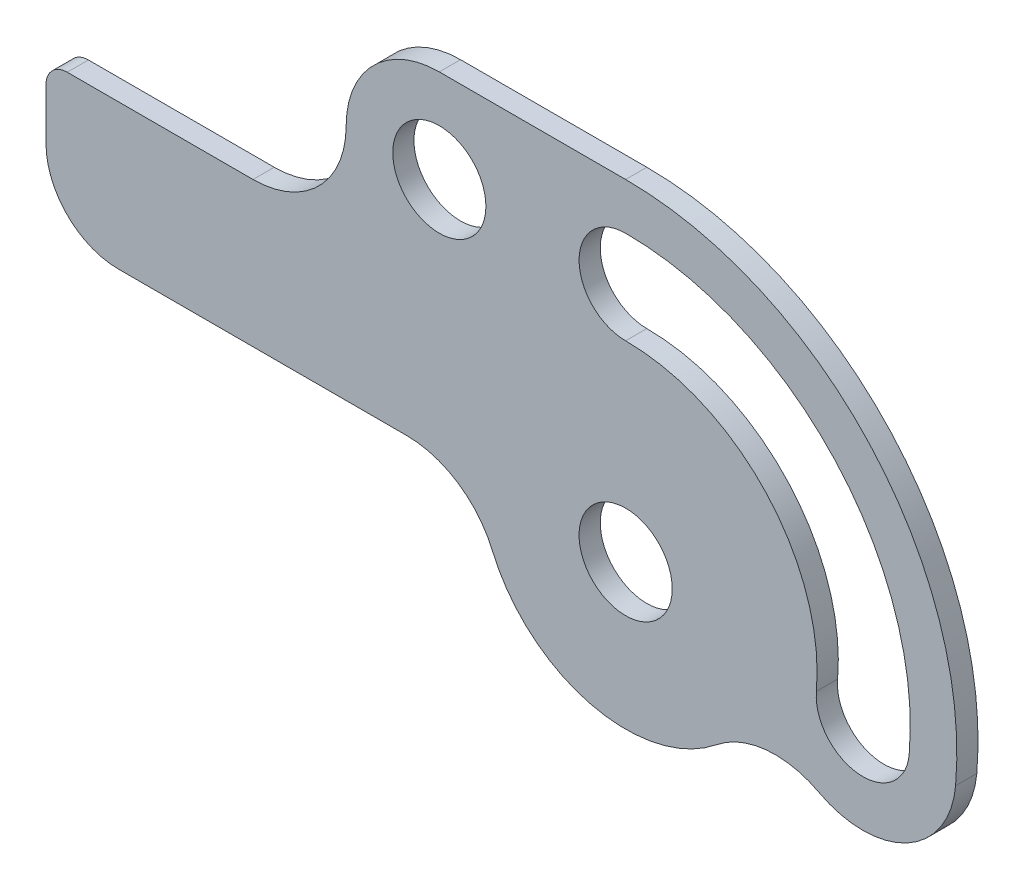
ISO-10303-21;
HEADER;
FILE_DESCRIPTION(('STEP AP214'),'2;1');
FILE_NAME('part.step','',(''),(''),'','','');
FILE_SCHEMA(('AUTOMOTIVE_DESIGN { 1 0 10303 214 1 1 1 1 }'));
ENDSEC;
DATA;
#1=APPLICATION_CONTEXT('core data for automotive mechanical design processes');
#2=APPLICATION_PROTOCOL_DEFINITION('international standard','automotive_design',2000,#1);
#3=PRODUCT_CONTEXT('',#1,'mechanical');
#4=PRODUCT('Part','Part','',(#3));
#5=PRODUCT_RELATED_PRODUCT_CATEGORY('part','',(#4));
#6=PRODUCT_DEFINITION_FORMATION('','',#4);
#7=PRODUCT_DEFINITION_CONTEXT('part definition',#1,'design');
#8=PRODUCT_DEFINITION('design','',#6,#7);
#9=PRODUCT_DEFINITION_SHAPE('','',#8);
#10=(LENGTH_UNIT() NAMED_UNIT(*) SI_UNIT(.MILLI.,.METRE.));
#11=(NAMED_UNIT(*) PLANE_ANGLE_UNIT() SI_UNIT($,.RADIAN.));
#12=(NAMED_UNIT(*) SI_UNIT($,.STERADIAN.) SOLID_ANGLE_UNIT());
#13=UNCERTAINTY_MEASURE_WITH_UNIT(LENGTH_MEASURE(1.E-05),#10,'distance_accuracy_value','');
#14=(GEOMETRIC_REPRESENTATION_CONTEXT(3) GLOBAL_UNCERTAINTY_ASSIGNED_CONTEXT((#13)) GLOBAL_UNIT_ASSIGNED_CONTEXT((#10,
#11,#12)) REPRESENTATION_CONTEXT('',''));
#15=CARTESIAN_POINT('',(0.,0.,0.));
#16=DIRECTION('',(0.,0.,1.));
#17=DIRECTION('',(1.,0.,0.));
#18=AXIS2_PLACEMENT_3D('',#15,#16,#17);
#19=CARTESIAN_POINT('',(2.778125,2.778125,0.8128));
#20=DIRECTION('',(0.,0.,-1.));
#21=DIRECTION('',(-1.,0.,0.));
#22=AXIS2_PLACEMENT_3D('',#19,#20,#21);
#23=CYLINDRICAL_SURFACE('',#22,2.778125);
#24=CARTESIAN_POINT('',(2.778125,2.778125,0.));
#25=DIRECTION('',(0.,0.,1.));
#26=DIRECTION('',(1.,0.,0.));
#27=AXIS2_PLACEMENT_3D('',#24,#25,#26);
#28=CIRCLE('',#27,2.778125);
#29=CARTESIAN_POINT('',(0.,2.778125,0.));
#30=VERTEX_POINT('',#29);
#31=CARTESIAN_POINT('',(2.778125,0.,0.));
#32=VERTEX_POINT('',#31);
#33=EDGE_CURVE('E303',#30,#32,#28,.T.);
#34=ORIENTED_EDGE('',*,*,#33,.T.);
#35=DIRECTION('',(0.,0.,-1.));
#36=VECTOR('',#35,1.);
#37=CARTESIAN_POINT('',(2.778125,0.,0.8128));
#38=LINE('',#37,#36);
#39=CARTESIAN_POINT('',(2.778125,0.,0.8128));
#40=VERTEX_POINT('',#39);
#41=EDGE_CURVE('E334',#40,#32,#38,.T.);
#42=ORIENTED_EDGE('',*,*,#41,.F.);
#43=CARTESIAN_POINT('',(2.778125,2.778125,0.8128));
#44=DIRECTION('',(0.,0.,1.));
#45=DIRECTION('',(1.,0.,0.));
#46=AXIS2_PLACEMENT_3D('',#43,#44,#45);
#47=CIRCLE('',#46,2.778125);
#48=CARTESIAN_POINT('',(0.,2.778125,0.8128));
#49=VERTEX_POINT('',#48);
#50=EDGE_CURVE('E242',#49,#40,#47,.T.);
#51=ORIENTED_EDGE('',*,*,#50,.F.);
#52=DIRECTION('',(0.,0.,-1.));
#53=VECTOR('',#52,1.);
#54=CARTESIAN_POINT('',(0.,2.778125,0.8128));
#55=LINE('',#54,#53);
#56=EDGE_CURVE('E337',#49,#30,#55,.T.);
#57=ORIENTED_EDGE('',*,*,#56,.T.);
#58=EDGE_LOOP('',(#34,#42,#51,#57));
#59=FACE_BOUND('',#58,.T.);
#60=ADVANCED_FACE('F83',(#59),#23,.T.);
#61=CARTESIAN_POINT('',(15.08125,9.128125,0.8128));
#62=DIRECTION('',(0.,0.,-1.));
#63=DIRECTION('',(-1.,0.,0.));
#64=AXIS2_PLACEMENT_3D('',#61,#62,#63);
#65=CYLINDRICAL_SURFACE('',#64,1.7859375);
#66=CARTESIAN_POINT('',(15.08125,9.128125,0.8128));
#67=DIRECTION('',(0.,0.,1.));
#68=DIRECTION('',(1.,0.,0.));
#69=AXIS2_PLACEMENT_3D('',#66,#67,#68);
#70=CIRCLE('',#69,1.7859375);
#71=CARTESIAN_POINT('',(16.8671875,9.128125,0.8128));
#72=VERTEX_POINT('',#71);
#73=EDGE_CURVE('E252',#72,#72,#70,.T.);
#74=ORIENTED_EDGE('',*,*,#73,.T.);
#75=EDGE_LOOP('',(#74));
#76=FACE_BOUND('',#75,.T.);
#77=CARTESIAN_POINT('',(15.08125,9.128125,0.));
#78=DIRECTION('',(0.,0.,1.));
#79=DIRECTION('',(1.,0.,0.));
#80=AXIS2_PLACEMENT_3D('',#77,#78,#79);
#81=CIRCLE('',#80,1.7859375);
#82=CARTESIAN_POINT('',(16.8671875,9.128125,0.));
#83=VERTEX_POINT('',#82);
#84=EDGE_CURVE('E324',#83,#83,#81,.T.);
#85=ORIENTED_EDGE('',*,*,#84,.F.);
#86=EDGE_LOOP('',(#85));
#87=FACE_BOUND('',#86,.T.);
#88=ADVANCED_FACE('F440',(#76,#87),#65,.F.);
#89=CARTESIAN_POINT('',(22.225,0.,0.8128));
#90=DIRECTION('',(0.,0.,-1.));
#91=DIRECTION('',(-1.,0.,0.));
#92=AXIS2_PLACEMENT_3D('',#89,#90,#91);
#93=CYLINDRICAL_SURFACE('',#92,1.7859375);
#94=CARTESIAN_POINT('',(22.225,0.,0.8128));
#95=DIRECTION('',(0.,0.,1.));
#96=DIRECTION('',(1.,0.,0.));
#97=AXIS2_PLACEMENT_3D('',#94,#95,#96);
#98=CIRCLE('',#97,1.7859375);
#99=CARTESIAN_POINT('',(24.0109375,0.,0.8128));
#100=VERTEX_POINT('',#99);
#101=EDGE_CURVE('E248',#100,#100,#98,.T.);
#102=ORIENTED_EDGE('',*,*,#101,.T.);
#103=EDGE_LOOP('',(#102));
#104=FACE_BOUND('',#103,.T.);
#105=CARTESIAN_POINT('',(22.225,0.,0.));
#106=DIRECTION('',(0.,0.,1.));
#107=DIRECTION('',(1.,0.,0.));
#108=AXIS2_PLACEMENT_3D('',#105,#106,#107);
#109=CIRCLE('',#108,1.7859375);
#110=CARTESIAN_POINT('',(24.0109375,0.,0.));
#111=VERTEX_POINT('',#110);
#112=EDGE_CURVE('E320',#111,#111,#109,.T.);
#113=ORIENTED_EDGE('',*,*,#112,.F.);
#114=EDGE_LOOP('',(#113));
#115=FACE_BOUND('',#114,.T.);
#116=ADVANCED_FACE('F442',(#104,#115),#93,.F.);
#117=CARTESIAN_POINT('',(31.3183897285187,-0.795568514268431,0.8128));
#118=DIRECTION('',(0.,0.,-1.));
#119=DIRECTION('',(-1.,0.,0.));
#120=AXIS2_PLACEMENT_3D('',#117,#118,#119);
#121=CYLINDRICAL_SURFACE('',#120,1.7859375);
#122=CARTESIAN_POINT('',(31.3183897285187,-0.795568514268431,0.));
#123=DIRECTION('',(0.,0.,1.));
#124=DIRECTION('',(1.,0.,0.));
#125=AXIS2_PLACEMENT_3D('',#122,#123,#124);
#126=CIRCLE('',#125,1.7859375);
#127=CARTESIAN_POINT('',(29.5392482598955,-0.639913804955042,0.));
#128=VERTEX_POINT('',#127);
#129=CARTESIAN_POINT('',(33.0975311971419,-0.95122322358182,0.));
#130=VERTEX_POINT('',#129);
#131=EDGE_CURVE('E261',#128,#130,#126,.T.);
#132=ORIENTED_EDGE('',*,*,#131,.F.);
#133=DIRECTION('',(0.,0.,-1.));
#134=VECTOR('',#133,1.);
#135=CARTESIAN_POINT('',(29.5392482598955,-0.639913804955042,0.8128));
#136=LINE('',#135,#134);
#137=CARTESIAN_POINT('',(29.5392482598955,-0.639913804955042,0.8128));
#138=VERTEX_POINT('',#137);
#139=EDGE_CURVE('E362',#138,#128,#136,.T.);
#140=ORIENTED_EDGE('',*,*,#139,.F.);
#141=CARTESIAN_POINT('',(31.3183897285187,-0.795568514268431,0.8128));
#142=DIRECTION('',(0.,0.,1.));
#143=DIRECTION('',(1.,0.,0.));
#144=AXIS2_PLACEMENT_3D('',#141,#142,#143);
#145=CIRCLE('',#144,1.7859375);
#146=CARTESIAN_POINT('',(33.0975311971419,-0.95122322358182,0.8128));
#147=VERTEX_POINT('',#146);
#148=EDGE_CURVE('E372',#138,#147,#145,.T.);
#149=ORIENTED_EDGE('',*,*,#148,.T.);
#150=DIRECTION('',(0.,0.,-1.));
#151=VECTOR('',#150,1.);
#152=CARTESIAN_POINT('',(33.0975311971419,-0.95122322358182,0.8128));
#153=LINE('',#152,#151);
#154=EDGE_CURVE('E87',#147,#130,#153,.T.);
#155=ORIENTED_EDGE('',*,*,#154,.T.);
#156=EDGE_LOOP('',(#132,#140,#149,#155));
#157=FACE_BOUND('',#156,.T.);
#158=ADVANCED_FACE('F371',(#157),#121,.F.);
#159=CARTESIAN_POINT('',(22.225,0.,0.8128));
#160=DIRECTION('',(0.,0.,-1.));
#161=DIRECTION('',(-1.,0.,0.));
#162=AXIS2_PLACEMENT_3D('',#159,#160,#161);
#163=CYLINDRICAL_SURFACE('',#162,7.3421875);
#164=CARTESIAN_POINT('',(22.225,0.,0.));
#165=DIRECTION('',(0.,0.,1.));
#166=DIRECTION('',(1.,0.,0.));
#167=AXIS2_PLACEMENT_3D('',#164,#165,#166);
#168=CIRCLE('',#167,7.3421875);
#169=CARTESIAN_POINT('',(22.225,7.3421875,0.));
#170=VERTEX_POINT('',#169);
#171=EDGE_CURVE('E265',#170,#128,#168,.F.);
#172=ORIENTED_EDGE('',*,*,#171,.F.);
#173=DIRECTION('',(0.,0.,-1.));
#174=VECTOR('',#173,1.);
#175=CARTESIAN_POINT('',(22.225,7.3421875,0.8128));
#176=LINE('',#175,#174);
#177=CARTESIAN_POINT('',(22.225,7.3421875,0.8128));
#178=VERTEX_POINT('',#177);
#179=EDGE_CURVE('E360',#178,#170,#176,.T.);
#180=ORIENTED_EDGE('',*,*,#179,.F.);
#181=CARTESIAN_POINT('',(22.225,0.,0.8128));
#182=DIRECTION('',(0.,0.,1.));
#183=DIRECTION('',(1.,0.,0.));
#184=AXIS2_PLACEMENT_3D('',#181,#182,#183);
#185=CIRCLE('',#184,7.3421875);
#186=EDGE_CURVE('E381',#178,#138,#185,.F.);
#187=ORIENTED_EDGE('',*,*,#186,.T.);
#188=ORIENTED_EDGE('',*,*,#139,.T.);
#189=EDGE_LOOP('',(#172,#180,#187,#188));
#190=FACE_BOUND('',#189,.T.);
#191=ADVANCED_FACE('F379',(#190),#163,.T.);
#192=CARTESIAN_POINT('',(22.225,9.128125,0.8128));
#193=DIRECTION('',(0.,0.,-1.));
#194=DIRECTION('',(-1.,0.,0.));
#195=AXIS2_PLACEMENT_3D('',#192,#193,#194);
#196=CYLINDRICAL_SURFACE('',#195,1.7859375);
#197=CARTESIAN_POINT('',(22.225,9.128125,0.));
#198=DIRECTION('',(0.,0.,1.));
#199=DIRECTION('',(1.,0.,0.));
#200=AXIS2_PLACEMENT_3D('',#197,#198,#199);
#201=CIRCLE('',#200,1.7859375);
#202=CARTESIAN_POINT('',(22.225,10.9140625,0.));
#203=VERTEX_POINT('',#202);
#204=EDGE_CURVE('E269',#203,#170,#201,.T.);
#205=ORIENTED_EDGE('',*,*,#204,.F.);
#206=DIRECTION('',(0.,0.,-1.));
#207=VECTOR('',#206,1.);
#208=CARTESIAN_POINT('',(22.225,10.9140625,0.8128));
#209=LINE('',#208,#207);
#210=CARTESIAN_POINT('',(22.225,10.9140625,0.8128));
#211=VERTEX_POINT('',#210);
#212=EDGE_CURVE('E256',#211,#203,#209,.T.);
#213=ORIENTED_EDGE('',*,*,#212,.F.);
#214=CARTESIAN_POINT('',(22.225,9.128125,0.8128));
#215=DIRECTION('',(0.,0.,1.));
#216=DIRECTION('',(1.,0.,0.));
#217=AXIS2_PLACEMENT_3D('',#214,#215,#216);
#218=CIRCLE('',#217,1.7859375);
#219=EDGE_CURVE('E384',#211,#178,#218,.T.);
#220=ORIENTED_EDGE('',*,*,#219,.T.);
#221=ORIENTED_EDGE('',*,*,#179,.T.);
#222=EDGE_LOOP('',(#205,#213,#220,#221));
#223=FACE_BOUND('',#222,.T.);
#224=ADVANCED_FACE('F387',(#223),#196,.F.);
#225=CARTESIAN_POINT('',(22.225,0.,0.8128));
#226=DIRECTION('',(0.,0.,-1.));
#227=DIRECTION('',(-1.,0.,0.));
#228=AXIS2_PLACEMENT_3D('',#225,#226,#227);
#229=CYLINDRICAL_SURFACE('',#228,10.9140625);
#230=CARTESIAN_POINT('',(22.225,0.,0.));
#231=DIRECTION('',(0.,0.,1.));
#232=DIRECTION('',(1.,0.,0.));
#233=AXIS2_PLACEMENT_3D('',#230,#231,#232);
#234=CIRCLE('',#233,10.9140625);
#235=EDGE_CURVE('E257',#203,#130,#234,.F.);
#236=ORIENTED_EDGE('',*,*,#235,.T.);
#237=ORIENTED_EDGE('',*,*,#154,.F.);
#238=CARTESIAN_POINT('',(22.225,0.,0.8128));
#239=DIRECTION('',(0.,0.,1.));
#240=DIRECTION('',(1.,0.,0.));
#241=AXIS2_PLACEMENT_3D('',#238,#239,#240);
#242=CIRCLE('',#241,10.9140625);
#243=EDGE_CURVE('E169',#211,#147,#242,.F.);
#244=ORIENTED_EDGE('',*,*,#243,.F.);
#245=ORIENTED_EDGE('',*,*,#212,.T.);
#246=EDGE_LOOP('',(#236,#237,#244,#245));
#247=FACE_BOUND('',#246,.T.);
#248=ADVANCED_FACE('F85',(#247),#229,.F.);
#249=CARTESIAN_POINT('',(0.,0.,0.8128));
#250=DIRECTION('',(0.,-1.,0.));
#251=DIRECTION('',(0.,0.,-1.));
#252=AXIS2_PLACEMENT_3D('',#249,#250,#251);
#253=PLANE('',#252);
#254=DIRECTION('',(-1.,0.,0.));
#255=VECTOR('',#254,1.);
#256=CARTESIAN_POINT('',(0.,0.,0.));
#257=LINE('',#256,#255);
#258=CARTESIAN_POINT('',(13.8247395873699,0.,0.));
#259=VERTEX_POINT('',#258);
#260=EDGE_CURVE('E307',#259,#32,#257,.T.);
#261=ORIENTED_EDGE('',*,*,#260,.F.);
#262=DIRECTION('',(0.,0.,-1.));
#263=VECTOR('',#262,1.);
#264=CARTESIAN_POINT('',(13.8247395873699,0.,0.8128));
#265=LINE('',#264,#263);
#266=CARTESIAN_POINT('',(13.8247395873699,0.,0.8128));
#267=VERTEX_POINT('',#266);
#268=EDGE_CURVE('E223',#267,#259,#265,.T.);
#269=ORIENTED_EDGE('',*,*,#268,.F.);
#270=DIRECTION('',(-1.,0.,0.));
#271=VECTOR('',#270,1.);
#272=CARTESIAN_POINT('',(0.,0.,0.8128));
#273=LINE('',#272,#271);
#274=EDGE_CURVE('E238',#267,#40,#273,.T.);
#275=ORIENTED_EDGE('',*,*,#274,.T.);
#276=ORIENTED_EDGE('',*,*,#41,.T.);
#277=EDGE_LOOP('',(#261,#269,#275,#276));
#278=FACE_BOUND('',#277,.T.);
#279=ADVANCED_FACE('F425',(#278),#253,.T.);
#280=CARTESIAN_POINT('',(13.8247395873699,-3.571875,0.8128));
#281=DIRECTION('',(0.,0.,-1.));
#282=DIRECTION('',(-1.,0.,0.));
#283=AXIS2_PLACEMENT_3D('',#280,#281,#282);
#284=CYLINDRICAL_SURFACE('',#283,3.571875);
#285=CARTESIAN_POINT('',(13.8247395873699,-3.571875,0.));
#286=DIRECTION('',(0.,0.,1.));
#287=DIRECTION('',(1.,0.,0.));
#288=AXIS2_PLACEMENT_3D('',#285,#286,#287);
#289=CIRCLE('',#288,3.571875);
#290=CARTESIAN_POINT('',(17.1117980097034,-2.17418478260869,0.));
#291=VERTEX_POINT('',#290);
#292=EDGE_CURVE('E219',#291,#259,#289,.T.);
#293=ORIENTED_EDGE('',*,*,#292,.F.);
#294=DIRECTION('',(0.,0.,-1.));
#295=VECTOR('',#294,1.);
#296=CARTESIAN_POINT('',(17.1117980097034,-2.17418478260869,0.8128));
#297=LINE('',#296,#295);
#298=CARTESIAN_POINT('',(17.1117980097034,-2.17418478260869,0.8128));
#299=VERTEX_POINT('',#298);
#300=EDGE_CURVE('E213',#299,#291,#297,.T.);
#301=ORIENTED_EDGE('',*,*,#300,.F.);
#302=CARTESIAN_POINT('',(13.8247395873699,-3.571875,0.8128));
#303=DIRECTION('',(0.,0.,1.));
#304=DIRECTION('',(1.,0.,0.));
#305=AXIS2_PLACEMENT_3D('',#302,#303,#304);
#306=CIRCLE('',#305,3.571875);
#307=EDGE_CURVE('E217',#299,#267,#306,.T.);
#308=ORIENTED_EDGE('',*,*,#307,.T.);
#309=ORIENTED_EDGE('',*,*,#268,.T.);
#310=EDGE_LOOP('',(#293,#301,#308,#309));
#311=FACE_BOUND('',#310,.T.);
#312=ADVANCED_FACE('F215',(#311),#284,.F.);
#313=CARTESIAN_POINT('',(22.225,0.,0.8128));
#314=DIRECTION('',(0.,0.,-1.));
#315=DIRECTION('',(-1.,0.,0.));
#316=AXIS2_PLACEMENT_3D('',#313,#314,#315);
#317=CYLINDRICAL_SURFACE('',#316,5.55625);
#318=CARTESIAN_POINT('',(22.225,0.,0.));
#319=DIRECTION('',(0.,0.,1.));
#320=DIRECTION('',(1.,0.,0.));
#321=AXIS2_PLACEMENT_3D('',#318,#319,#320);
#322=CIRCLE('',#321,5.55625);
#323=CARTESIAN_POINT('',(25.7162801448804,-4.3223693748295,0.));
#324=VERTEX_POINT('',#323);
#325=EDGE_CURVE('E313',#291,#324,#322,.T.);
#326=ORIENTED_EDGE('',*,*,#325,.T.);
#327=DIRECTION('',(0.,0.,-1.));
#328=VECTOR('',#327,1.);
#329=CARTESIAN_POINT('',(25.7162801448804,-4.3223693748295,0.8128));
#330=LINE('',#329,#328);
#331=CARTESIAN_POINT('',(25.7162801448804,-4.3223693748295,0.8128));
#332=VERTEX_POINT('',#331);
#333=EDGE_CURVE('E156',#332,#324,#330,.T.);
#334=ORIENTED_EDGE('',*,*,#333,.F.);
#335=CARTESIAN_POINT('',(22.225,0.,0.8128));
#336=DIRECTION('',(0.,0.,1.));
#337=DIRECTION('',(1.,0.,0.));
#338=AXIS2_PLACEMENT_3D('',#335,#336,#337);
#339=CIRCLE('',#338,5.55625);
#340=EDGE_CURVE('E225',#299,#332,#339,.T.);
#341=ORIENTED_EDGE('',*,*,#340,.F.);
#342=ORIENTED_EDGE('',*,*,#300,.T.);
#343=EDGE_LOOP('',(#326,#334,#341,#342));
#344=FACE_BOUND('',#343,.T.);
#345=ADVANCED_FACE('F226',(#344),#317,.T.);
#346=CARTESIAN_POINT('',(27.9606745237321,-7.10103540150561,0.8128));
#347=DIRECTION('',(0.,0.,-1.));
#348=DIRECTION('',(-1.,0.,0.));
#349=AXIS2_PLACEMENT_3D('',#346,#347,#348);
#350=CYLINDRICAL_SURFACE('',#349,3.57187499999999);
#351=CARTESIAN_POINT('',(27.9606745237321,-7.10103540150561,0.));
#352=DIRECTION('',(0.,0.,1.));
#353=DIRECTION('',(1.,0.,0.));
#354=AXIS2_PLACEMENT_3D('',#351,#352,#353);
#355=CIRCLE('',#354,3.57187499999999);
#356=CARTESIAN_POINT('',(29.6395321261254,-3.94830195788702,0.));
#357=VERTEX_POINT('',#356);
#358=EDGE_CURVE('E316',#357,#324,#355,.T.);
#359=ORIENTED_EDGE('',*,*,#358,.F.);
#360=DIRECTION('',(0.,0.,-1.));
#361=VECTOR('',#360,1.);
#362=CARTESIAN_POINT('',(29.6395321261254,-3.94830195788702,0.8128));
#363=LINE('',#362,#361);
#364=CARTESIAN_POINT('',(29.6395321261254,-3.94830195788702,0.8128));
#365=VERTEX_POINT('',#364);
#366=EDGE_CURVE('E103',#365,#357,#363,.T.);
#367=ORIENTED_EDGE('',*,*,#366,.F.);
#368=CARTESIAN_POINT('',(27.9606745237321,-7.10103540150561,0.8128));
#369=DIRECTION('',(0.,0.,1.));
#370=DIRECTION('',(1.,0.,0.));
#371=AXIS2_PLACEMENT_3D('',#368,#369,#370);
#372=CIRCLE('',#371,3.57187499999999);
#373=EDGE_CURVE('E230',#365,#332,#372,.T.);
#374=ORIENTED_EDGE('',*,*,#373,.T.);
#375=ORIENTED_EDGE('',*,*,#333,.T.);
#376=EDGE_LOOP('',(#359,#367,#374,#375));
#377=FACE_BOUND('',#376,.T.);
#378=ADVANCED_FACE('F428',(#377),#350,.F.);
#379=CARTESIAN_POINT('',(31.3183897285187,-0.795568514268431,0.8128));
#380=DIRECTION('',(0.,0.,-1.));
#381=DIRECTION('',(-1.,0.,0.));
#382=AXIS2_PLACEMENT_3D('',#379,#380,#381);
#383=CYLINDRICAL_SURFACE('',#382,3.57187499999999);
#384=CARTESIAN_POINT('',(31.3183897285187,-0.795568514268431,0.));
#385=DIRECTION('',(0.,0.,1.));
#386=DIRECTION('',(1.,0.,0.));
#387=AXIS2_PLACEMENT_3D('',#384,#385,#386);
#388=CIRCLE('',#387,3.57187499999999);
#389=CARTESIAN_POINT('',(34.8766726657652,-1.10687793289521,0.));
#390=VERTEX_POINT('',#389);
#391=EDGE_CURVE('E273',#357,#390,#388,.T.);
#392=ORIENTED_EDGE('',*,*,#391,.T.);
#393=DIRECTION('',(0.,0.,-1.));
#394=VECTOR('',#393,1.);
#395=CARTESIAN_POINT('',(34.8766726657652,-1.10687793289521,0.8128));
#396=LINE('',#395,#394);
#397=CARTESIAN_POINT('',(34.8766726657652,-1.10687793289521,0.8128));
#398=VERTEX_POINT('',#397);
#399=EDGE_CURVE('E12',#398,#390,#396,.T.);
#400=ORIENTED_EDGE('',*,*,#399,.F.);
#401=CARTESIAN_POINT('',(31.3183897285187,-0.795568514268431,0.8128));
#402=DIRECTION('',(0.,0.,1.));
#403=DIRECTION('',(1.,0.,0.));
#404=AXIS2_PLACEMENT_3D('',#401,#402,#403);
#405=CIRCLE('',#404,3.57187499999999);
#406=EDGE_CURVE('E389',#365,#398,#405,.T.);
#407=ORIENTED_EDGE('',*,*,#406,.F.);
#408=ORIENTED_EDGE('',*,*,#366,.T.);
#409=EDGE_LOOP('',(#392,#400,#407,#408));
#410=FACE_BOUND('',#409,.T.);
#411=ADVANCED_FACE('F430',(#410),#383,.T.);
#412=CARTESIAN_POINT('',(22.225,0.,0.8128));
#413=DIRECTION('',(0.,0.,-1.));
#414=DIRECTION('',(-1.,0.,0.));
#415=AXIS2_PLACEMENT_3D('',#412,#413,#414);
#416=CYLINDRICAL_SURFACE('',#415,12.7);
#417=CARTESIAN_POINT('',(22.225,0.,0.));
#418=DIRECTION('',(0.,0.,1.));
#419=DIRECTION('',(1.,0.,0.));
#420=AXIS2_PLACEMENT_3D('',#417,#418,#419);
#421=CIRCLE('',#420,12.7);
#422=CARTESIAN_POINT('',(22.225,12.7,0.));
#423=VERTEX_POINT('',#422);
#424=EDGE_CURVE('E276',#423,#390,#421,.F.);
#425=ORIENTED_EDGE('',*,*,#424,.F.);
#426=DIRECTION('',(0.,0.,-1.));
#427=VECTOR('',#426,1.);
#428=CARTESIAN_POINT('',(22.225,12.7,0.8128));
#429=LINE('',#428,#427);
#430=CARTESIAN_POINT('',(22.225,12.7,0.8128));
#431=VERTEX_POINT('',#430);
#432=EDGE_CURVE('E94',#431,#423,#429,.T.);
#433=ORIENTED_EDGE('',*,*,#432,.F.);
#434=CARTESIAN_POINT('',(22.225,0.,0.8128));
#435=DIRECTION('',(0.,0.,1.));
#436=DIRECTION('',(1.,0.,0.));
#437=AXIS2_PLACEMENT_3D('',#434,#435,#436);
#438=CIRCLE('',#437,12.7);
#439=EDGE_CURVE('E392',#431,#398,#438,.F.);
#440=ORIENTED_EDGE('',*,*,#439,.T.);
#441=ORIENTED_EDGE('',*,*,#399,.T.);
#442=EDGE_LOOP('',(#425,#433,#440,#441));
#443=FACE_BOUND('',#442,.T.);
#444=ADVANCED_FACE('F436',(#443),#416,.T.);
#445=CARTESIAN_POINT('',(0.,12.7,0.8128));
#446=DIRECTION('',(0.,1.,0.));
#447=DIRECTION('',(0.,0.,1.));
#448=AXIS2_PLACEMENT_3D('',#445,#446,#447);
#449=PLANE('',#448);
#450=DIRECTION('',(1.,0.,0.));
#451=VECTOR('',#450,1.);
#452=CARTESIAN_POINT('',(0.,12.7,0.));
#453=LINE('',#452,#451);
#454=CARTESIAN_POINT('',(15.08125,12.7,0.));
#455=VERTEX_POINT('',#454);
#456=EDGE_CURVE('E280',#455,#423,#453,.T.);
#457=ORIENTED_EDGE('',*,*,#456,.F.);
#458=DIRECTION('',(0.,0.,-1.));
#459=VECTOR('',#458,1.);
#460=CARTESIAN_POINT('',(15.08125,12.7,0.8128));
#461=LINE('',#460,#459);
#462=CARTESIAN_POINT('',(15.08125,12.7,0.8128));
#463=VERTEX_POINT('',#462);
#464=EDGE_CURVE('E353',#463,#455,#461,.T.);
#465=ORIENTED_EDGE('',*,*,#464,.F.);
#466=DIRECTION('',(1.,0.,0.));
#467=VECTOR('',#466,1.);
#468=CARTESIAN_POINT('',(0.,12.7,0.8128));
#469=LINE('',#468,#467);
#470=EDGE_CURVE('E399',#463,#431,#469,.T.);
#471=ORIENTED_EDGE('',*,*,#470,.T.);
#472=ORIENTED_EDGE('',*,*,#432,.T.);
#473=EDGE_LOOP('',(#457,#465,#471,#472));
#474=FACE_BOUND('',#473,.T.);
#475=ADVANCED_FACE('F478',(#474),#449,.T.);
#476=CARTESIAN_POINT('',(15.08125,9.128125,0.8128));
#477=DIRECTION('',(0.,0.,-1.));
#478=DIRECTION('',(-1.,0.,0.));
#479=AXIS2_PLACEMENT_3D('',#476,#477,#478);
#480=CYLINDRICAL_SURFACE('',#479,3.571875);
#481=CARTESIAN_POINT('',(15.08125,9.128125,0.));
#482=DIRECTION('',(0.,0.,1.));
#483=DIRECTION('',(1.,0.,0.));
#484=AXIS2_PLACEMENT_3D('',#481,#482,#483);
#485=CIRCLE('',#484,3.571875);
#486=CARTESIAN_POINT('',(11.509375,9.128125,0.));
#487=VERTEX_POINT('',#486);
#488=EDGE_CURVE('E284',#455,#487,#485,.T.);
#489=ORIENTED_EDGE('',*,*,#488,.T.);
#490=DIRECTION('',(0.,0.,-1.));
#491=VECTOR('',#490,1.);
#492=CARTESIAN_POINT('',(11.509375,9.128125,0.8128));
#493=LINE('',#492,#491);
#494=CARTESIAN_POINT('',(11.509375,9.128125,0.8128));
#495=VERTEX_POINT('',#494);
#496=EDGE_CURVE('E350',#495,#487,#493,.T.);
#497=ORIENTED_EDGE('',*,*,#496,.F.);
#498=CARTESIAN_POINT('',(15.08125,9.128125,0.8128));
#499=DIRECTION('',(0.,0.,1.));
#500=DIRECTION('',(1.,0.,0.));
#501=AXIS2_PLACEMENT_3D('',#498,#499,#500);
#502=CIRCLE('',#501,3.571875);
#503=EDGE_CURVE('E403',#463,#495,#502,.T.);
#504=ORIENTED_EDGE('',*,*,#503,.F.);
#505=ORIENTED_EDGE('',*,*,#464,.T.);
#506=EDGE_LOOP('',(#489,#497,#504,#505));
#507=FACE_BOUND('',#506,.T.);
#508=ADVANCED_FACE('F474',(#507),#480,.T.);
#509=CARTESIAN_POINT('',(7.9375,9.128125,0.8128));
#510=DIRECTION('',(0.,0.,-1.));
#511=DIRECTION('',(-1.,0.,0.));
#512=AXIS2_PLACEMENT_3D('',#509,#510,#511);
#513=CYLINDRICAL_SURFACE('',#512,3.571875);
#514=CARTESIAN_POINT('',(7.9375,9.128125,0.));
#515=DIRECTION('',(0.,0.,1.));
#516=DIRECTION('',(1.,0.,0.));
#517=AXIS2_PLACEMENT_3D('',#514,#515,#516);
#518=CIRCLE('',#517,3.571875);
#519=CARTESIAN_POINT('',(7.9375,5.55625,0.));
#520=VERTEX_POINT('',#519);
#521=EDGE_CURVE('E288',#520,#487,#518,.T.);
#522=ORIENTED_EDGE('',*,*,#521,.F.);
#523=DIRECTION('',(0.,0.,-1.));
#524=VECTOR('',#523,1.);
#525=CARTESIAN_POINT('',(7.9375,5.55625,0.8128));
#526=LINE('',#525,#524);
#527=CARTESIAN_POINT('',(7.9375,5.55625,0.8128));
#528=VERTEX_POINT('',#527);
#529=EDGE_CURVE('E346',#528,#520,#526,.T.);
#530=ORIENTED_EDGE('',*,*,#529,.F.);
#531=CARTESIAN_POINT('',(7.9375,9.128125,0.8128));
#532=DIRECTION('',(0.,0.,1.));
#533=DIRECTION('',(1.,0.,0.));
#534=AXIS2_PLACEMENT_3D('',#531,#532,#533);
#535=CIRCLE('',#534,3.571875);
#536=EDGE_CURVE('E406',#528,#495,#535,.T.);
#537=ORIENTED_EDGE('',*,*,#536,.T.);
#538=ORIENTED_EDGE('',*,*,#496,.T.);
#539=EDGE_LOOP('',(#522,#530,#537,#538));
#540=FACE_BOUND('',#539,.T.);
#541=ADVANCED_FACE('F456',(#540),#513,.F.);
#542=CARTESIAN_POINT('',(0.,0.,0.));
#543=DIRECTION('',(0.,0.,1.));
#544=DIRECTION('',(1.,0.,0.));
#545=AXIS2_PLACEMENT_3D('',#542,#543,#544);
#546=PLANE('',#545);
#547=ORIENTED_EDGE('',*,*,#260,.T.);
#548=ORIENTED_EDGE('',*,*,#33,.F.);
#549=DIRECTION('',(0.,1.,0.));
#550=VECTOR('',#549,1.);
#551=CARTESIAN_POINT('',(0.,0.,0.));
#552=LINE('',#551,#550);
#553=CARTESIAN_POINT('',(0.,4.74255602648388,0.));
#554=VERTEX_POINT('',#553);
#555=EDGE_CURVE('E299',#30,#554,#552,.T.);
#556=ORIENTED_EDGE('',*,*,#555,.T.);
#557=CARTESIAN_POINT('',(0.813693973516123,4.74255602648388,0.));
#558=DIRECTION('',(0.,0.,1.));
#559=DIRECTION('',(1.,0.,0.));
#560=AXIS2_PLACEMENT_3D('',#557,#558,#559);
#561=CIRCLE('',#560,0.813693973516123);
#562=CARTESIAN_POINT('',(0.813693973516123,5.55625,0.));
#563=VERTEX_POINT('',#562);
#564=EDGE_CURVE('E295',#563,#554,#561,.T.);
#565=ORIENTED_EDGE('',*,*,#564,.F.);
#566=DIRECTION('',(1.,0.,0.));
#567=VECTOR('',#566,1.);
#568=CARTESIAN_POINT('',(0.,5.55625,0.));
#569=LINE('',#568,#567);
#570=EDGE_CURVE('E292',#563,#520,#569,.T.);
#571=ORIENTED_EDGE('',*,*,#570,.T.);
#572=ORIENTED_EDGE('',*,*,#521,.T.);
#573=ORIENTED_EDGE('',*,*,#488,.F.);
#574=ORIENTED_EDGE('',*,*,#456,.T.);
#575=ORIENTED_EDGE('',*,*,#424,.T.);
#576=ORIENTED_EDGE('',*,*,#391,.F.);
#577=ORIENTED_EDGE('',*,*,#358,.T.);
#578=ORIENTED_EDGE('',*,*,#325,.F.);
#579=ORIENTED_EDGE('',*,*,#292,.T.);
#580=EDGE_LOOP('',(#547,#548,#556,#565,#571,#572,#573,#574,#575,#576,#577,#578,#579));
#581=FACE_BOUND('',#580,.T.);
#582=ORIENTED_EDGE('',*,*,#235,.F.);
#583=ORIENTED_EDGE('',*,*,#204,.T.);
#584=ORIENTED_EDGE('',*,*,#171,.T.);
#585=ORIENTED_EDGE('',*,*,#131,.T.);
#586=EDGE_LOOP('',(#582,#583,#584,#585));
#587=FACE_BOUND('',#586,.T.);
#588=ORIENTED_EDGE('',*,*,#112,.T.);
#589=EDGE_LOOP('',(#588));
#590=FACE_BOUND('',#589,.T.);
#591=ORIENTED_EDGE('',*,*,#84,.T.);
#592=EDGE_LOOP('',(#591));
#593=FACE_BOUND('',#592,.T.);
#594=ADVANCED_FACE('F377',(#581,#587,#590,#593),#546,.F.);
#595=CARTESIAN_POINT('',(0.,0.,0.8128));
#596=DIRECTION('',(0.,0.,1.));
#597=DIRECTION('',(1.,0.,0.));
#598=AXIS2_PLACEMENT_3D('',#595,#596,#597);
#599=PLANE('',#598);
#600=ORIENTED_EDGE('',*,*,#243,.T.);
#601=ORIENTED_EDGE('',*,*,#148,.F.);
#602=ORIENTED_EDGE('',*,*,#186,.F.);
#603=ORIENTED_EDGE('',*,*,#219,.F.);
#604=EDGE_LOOP('',(#600,#601,#602,#603));
#605=FACE_BOUND('',#604,.T.);
#606=ORIENTED_EDGE('',*,*,#536,.F.);
#607=DIRECTION('',(1.,0.,0.));
#608=VECTOR('',#607,1.);
#609=CARTESIAN_POINT('',(0.,5.55625,0.8128));
#610=LINE('',#609,#608);
#611=CARTESIAN_POINT('',(0.813693973516123,5.55625,0.8128));
#612=VERTEX_POINT('',#611);
#613=EDGE_CURVE('E410',#612,#528,#610,.T.);
#614=ORIENTED_EDGE('',*,*,#613,.F.);
#615=CARTESIAN_POINT('',(0.813693973516123,4.74255602648388,0.8128));
#616=DIRECTION('',(0.,0.,1.));
#617=DIRECTION('',(1.,0.,0.));
#618=AXIS2_PLACEMENT_3D('',#615,#616,#617);
#619=CIRCLE('',#618,0.813693973516123);
#620=CARTESIAN_POINT('',(0.,4.74255602648388,0.8128));
#621=VERTEX_POINT('',#620);
#622=EDGE_CURVE('E413',#612,#621,#619,.T.);
#623=ORIENTED_EDGE('',*,*,#622,.T.);
#624=DIRECTION('',(0.,1.,0.));
#625=VECTOR('',#624,1.);
#626=CARTESIAN_POINT('',(0.,0.,0.8128));
#627=LINE('',#626,#625);
#628=EDGE_CURVE('E416',#49,#621,#627,.T.);
#629=ORIENTED_EDGE('',*,*,#628,.F.);
#630=ORIENTED_EDGE('',*,*,#50,.T.);
#631=ORIENTED_EDGE('',*,*,#274,.F.);
#632=ORIENTED_EDGE('',*,*,#307,.F.);
#633=ORIENTED_EDGE('',*,*,#340,.T.);
#634=ORIENTED_EDGE('',*,*,#373,.F.);
#635=ORIENTED_EDGE('',*,*,#406,.T.);
#636=ORIENTED_EDGE('',*,*,#439,.F.);
#637=ORIENTED_EDGE('',*,*,#470,.F.);
#638=ORIENTED_EDGE('',*,*,#503,.T.);
#639=EDGE_LOOP('',(#606,#614,#623,#629,#630,#631,#632,#633,#634,#635,#636,#637,#638));
#640=FACE_BOUND('',#639,.T.);
#641=ORIENTED_EDGE('',*,*,#101,.F.);
#642=EDGE_LOOP('',(#641));
#643=FACE_BOUND('',#642,.T.);
#644=ORIENTED_EDGE('',*,*,#73,.F.);
#645=EDGE_LOOP('',(#644));
#646=FACE_BOUND('',#645,.T.);
#647=ADVANCED_FACE('F234',(#605,#640,#643,#646),#599,.T.);
#648=CARTESIAN_POINT('',(0.,5.55625,0.8128));
#649=DIRECTION('',(0.,1.,0.));
#650=DIRECTION('',(0.,0.,1.));
#651=AXIS2_PLACEMENT_3D('',#648,#649,#650);
#652=PLANE('',#651);
#653=ORIENTED_EDGE('',*,*,#613,.T.);
#654=ORIENTED_EDGE('',*,*,#529,.T.);
#655=ORIENTED_EDGE('',*,*,#570,.F.);
#656=DIRECTION('',(0.,0.,-1.));
#657=VECTOR('',#656,1.);
#658=CARTESIAN_POINT('',(0.813693973516123,5.55625,0.8128));
#659=LINE('',#658,#657);
#660=EDGE_CURVE('E343',#612,#563,#659,.T.);
#661=ORIENTED_EDGE('',*,*,#660,.F.);
#662=EDGE_LOOP('',(#653,#654,#655,#661));
#663=FACE_BOUND('',#662,.T.);
#664=ADVANCED_FACE('F458',(#663),#652,.T.);
#665=CARTESIAN_POINT('',(0.813693973516123,4.74255602648388,0.8128));
#666=DIRECTION('',(0.,0.,-1.));
#667=DIRECTION('',(-1.,0.,0.));
#668=AXIS2_PLACEMENT_3D('',#665,#666,#667);
#669=CYLINDRICAL_SURFACE('',#668,0.813693973516123);
#670=ORIENTED_EDGE('',*,*,#564,.T.);
#671=DIRECTION('',(0.,0.,-1.));
#672=VECTOR('',#671,1.);
#673=CARTESIAN_POINT('',(0.,4.74255602648388,0.8128));
#674=LINE('',#673,#672);
#675=EDGE_CURVE('E340',#621,#554,#674,.T.);
#676=ORIENTED_EDGE('',*,*,#675,.F.);
#677=ORIENTED_EDGE('',*,*,#622,.F.);
#678=ORIENTED_EDGE('',*,*,#660,.T.);
#679=EDGE_LOOP('',(#670,#676,#677,#678));
#680=FACE_BOUND('',#679,.T.);
#681=ADVANCED_FACE('F462',(#680),#669,.T.);
#682=CARTESIAN_POINT('',(0.,0.,0.8128));
#683=DIRECTION('',(-1.,0.,0.));
#684=DIRECTION('',(0.,0.,1.));
#685=AXIS2_PLACEMENT_3D('',#682,#683,#684);
#686=PLANE('',#685);
#687=ORIENTED_EDGE('',*,*,#555,.F.);
#688=ORIENTED_EDGE('',*,*,#56,.F.);
#689=ORIENTED_EDGE('',*,*,#628,.T.);
#690=ORIENTED_EDGE('',*,*,#675,.T.);
#691=EDGE_LOOP('',(#687,#688,#689,#690));
#692=FACE_BOUND('',#691,.T.);
#693=ADVANCED_FACE('F451',(#692),#686,.T.);
#694=CLOSED_SHELL('',(#60,#88,#116,#158,#191,#224,#248,#279,#312,#345,#378,#411,#444,#475,#508,
#541,#594,#647,#664,#681,#693));
#695=MANIFOLD_SOLID_BREP('B2',#694);
#696=ADVANCED_BREP_SHAPE_REPRESENTATION('',(#18,#695),#14);
#697=SHAPE_DEFINITION_REPRESENTATION(#9,#696);
ENDSEC;
END-ISO-10303-21;
